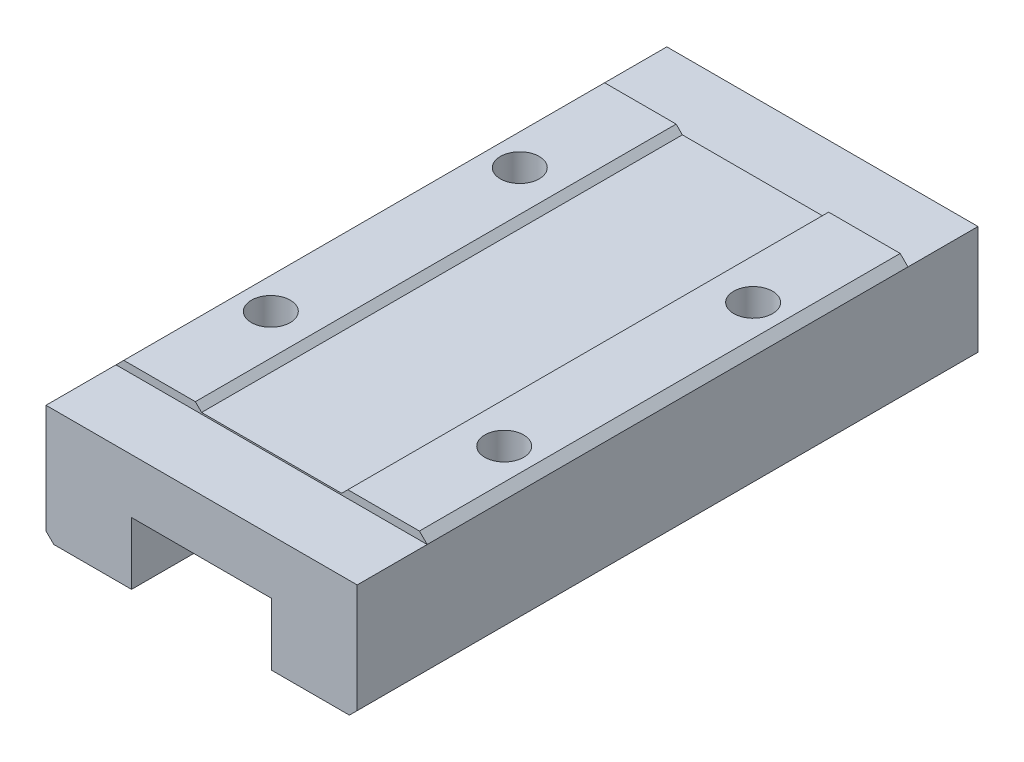
ISO-10303-21;
HEADER;
FILE_DESCRIPTION(('STEP AP214'),'2;1');
FILE_NAME('part.step','',(''),(''),'','','');
FILE_SCHEMA(('AUTOMOTIVE_DESIGN { 1 0 10303 214 1 1 1 1 }'));
ENDSEC;
DATA;
#1=APPLICATION_CONTEXT('core data for automotive mechanical design processes');
#2=APPLICATION_PROTOCOL_DEFINITION('international standard','automotive_design',2000,#1);
#3=PRODUCT_CONTEXT('',#1,'mechanical');
#4=PRODUCT('Part','Part','',(#3));
#5=PRODUCT_RELATED_PRODUCT_CATEGORY('part','',(#4));
#6=PRODUCT_DEFINITION_FORMATION('','',#4);
#7=PRODUCT_DEFINITION_CONTEXT('part definition',#1,'design');
#8=PRODUCT_DEFINITION('design','',#6,#7);
#9=PRODUCT_DEFINITION_SHAPE('','',#8);
#10=(LENGTH_UNIT() NAMED_UNIT(*) SI_UNIT(.MILLI.,.METRE.));
#11=(NAMED_UNIT(*) PLANE_ANGLE_UNIT() SI_UNIT($,.RADIAN.));
#12=(NAMED_UNIT(*) SI_UNIT($,.STERADIAN.) SOLID_ANGLE_UNIT());
#13=UNCERTAINTY_MEASURE_WITH_UNIT(LENGTH_MEASURE(1.E-05),#10,'distance_accuracy_value','');
#14=(GEOMETRIC_REPRESENTATION_CONTEXT(3) GLOBAL_UNCERTAINTY_ASSIGNED_CONTEXT((#13)) GLOBAL_UNIT_ASSIGNED_CONTEXT((#10,
#11,#12)) REPRESENTATION_CONTEXT('',''));
#15=CARTESIAN_POINT('',(0.,0.,0.));
#16=DIRECTION('',(0.,0.,1.));
#17=DIRECTION('',(1.,0.,0.));
#18=AXIS2_PLACEMENT_3D('',#15,#16,#17);
#19=CARTESIAN_POINT('',(-10.,10.,19.95));
#20=DIRECTION('',(0.,-1.,0.));
#21=DIRECTION('',(0.,0.,-1.));
#22=AXIS2_PLACEMENT_3D('',#19,#20,#21);
#23=PLANE('',#22);
#24=CARTESIAN_POINT('',(-7.5,10.,8.));
#25=DIRECTION('',(0.,1.,0.));
#26=DIRECTION('',(0.,0.,1.));
#27=AXIS2_PLACEMENT_3D('',#24,#25,#26);
#28=CIRCLE('',#27,1.25);
#29=CARTESIAN_POINT('',(-7.5,10.,9.25));
#30=VERTEX_POINT('',#29);
#31=EDGE_CURVE('E313',#30,#30,#28,.T.);
#32=ORIENTED_EDGE('',*,*,#31,.F.);
#33=EDGE_LOOP('',(#32));
#34=FACE_BOUND('',#33,.T.);
#35=CARTESIAN_POINT('',(-7.5,10.,-8.));
#36=DIRECTION('',(0.,1.,0.));
#37=DIRECTION('',(0.,0.,1.));
#38=AXIS2_PLACEMENT_3D('',#35,#36,#37);
#39=CIRCLE('',#38,1.25);
#40=CARTESIAN_POINT('',(-7.5,10.,-6.75));
#41=VERTEX_POINT('',#40);
#42=EDGE_CURVE('E337',#41,#41,#39,.T.);
#43=ORIENTED_EDGE('',*,*,#42,.F.);
#44=EDGE_LOOP('',(#43));
#45=FACE_BOUND('',#44,.T.);
#46=DIRECTION('',(-1.,0.,0.));
#47=VECTOR('',#46,1.);
#48=CARTESIAN_POINT('',(10.,10.,15.45));
#49=LINE('',#48,#47);
#50=CARTESIAN_POINT('',(-4.9,10.,15.45));
#51=VERTEX_POINT('',#50);
#52=CARTESIAN_POINT('',(-9.5,10.,15.45));
#53=VERTEX_POINT('',#52);
#54=EDGE_CURVE('E172',#51,#53,#49,.T.);
#55=ORIENTED_EDGE('',*,*,#54,.F.);
#56=DIRECTION('',(0.,0.,-1.));
#57=VECTOR('',#56,1.);
#58=CARTESIAN_POINT('',(-4.9,10.,19.95));
#59=LINE('',#58,#57);
#60=CARTESIAN_POINT('',(-4.9,10.,-15.45));
#61=VERTEX_POINT('',#60);
#62=EDGE_CURVE('E11',#51,#61,#59,.T.);
#63=ORIENTED_EDGE('',*,*,#62,.T.);
#64=DIRECTION('',(1.,0.,0.));
#65=VECTOR('',#64,1.);
#66=CARTESIAN_POINT('',(-10.,10.,-15.45));
#67=LINE('',#66,#65);
#68=CARTESIAN_POINT('',(-9.5,10.,-15.45));
#69=VERTEX_POINT('',#68);
#70=EDGE_CURVE('E345',#69,#61,#67,.T.);
#71=ORIENTED_EDGE('',*,*,#70,.F.);
#72=DIRECTION('',(0.,0.,1.));
#73=VECTOR('',#72,1.);
#74=CARTESIAN_POINT('',(-9.5,10.,19.95));
#75=LINE('',#74,#73);
#76=EDGE_CURVE('E203',#69,#53,#75,.T.);
#77=ORIENTED_EDGE('',*,*,#76,.T.);
#78=EDGE_LOOP('',(#55,#63,#71,#77));
#79=FACE_BOUND('',#78,.T.);
#80=ADVANCED_FACE('F16',(#34,#45,#79),#23,.F.);
#81=CARTESIAN_POINT('',(0.,0.,19.95));
#82=DIRECTION('',(0.,0.,-1.));
#83=DIRECTION('',(-1.,0.,0.));
#84=AXIS2_PLACEMENT_3D('',#81,#82,#83);
#85=PLANE('',#84);
#86=DIRECTION('',(1.,0.,0.));
#87=VECTOR('',#86,1.);
#88=CARTESIAN_POINT('',(10.,9.5,19.95));
#89=LINE('',#88,#87);
#90=CARTESIAN_POINT('',(-10.,9.5,19.95));
#91=VERTEX_POINT('',#90);
#92=CARTESIAN_POINT('',(10.,9.5,19.95));
#93=VERTEX_POINT('',#92);
#94=EDGE_CURVE('E362',#91,#93,#89,.T.);
#95=ORIENTED_EDGE('',*,*,#94,.F.);
#96=DIRECTION('',(0.,-1.,0.));
#97=VECTOR('',#96,1.);
#98=CARTESIAN_POINT('',(-10.,10.,19.95));
#99=LINE('',#98,#97);
#100=CARTESIAN_POINT('',(-10.,2.5,19.95));
#101=VERTEX_POINT('',#100);
#102=EDGE_CURVE('E292',#91,#101,#99,.T.);
#103=ORIENTED_EDGE('',*,*,#102,.T.);
#104=DIRECTION('',(-0.707106781186548,0.707106781186548,0.));
#105=VECTOR('',#104,1.);
#106=CARTESIAN_POINT('',(-9.5,2.,19.95));
#107=LINE('',#106,#105);
#108=CARTESIAN_POINT('',(-9.5,2.,19.95));
#109=VERTEX_POINT('',#108);
#110=EDGE_CURVE('E219',#101,#109,#107,.F.);
#111=ORIENTED_EDGE('',*,*,#110,.T.);
#112=DIRECTION('',(1.,0.,0.));
#113=VECTOR('',#112,1.);
#114=CARTESIAN_POINT('',(-10.,2.,19.95));
#115=LINE('',#114,#113);
#116=CARTESIAN_POINT('',(-4.5,2.,19.95));
#117=VERTEX_POINT('',#116);
#118=EDGE_CURVE('E289',#109,#117,#115,.T.);
#119=ORIENTED_EDGE('',*,*,#118,.T.);
#120=DIRECTION('',(0.,1.,0.));
#121=VECTOR('',#120,1.);
#122=CARTESIAN_POINT('',(-4.5,2.,19.95));
#123=LINE('',#122,#121);
#124=CARTESIAN_POINT('',(-4.5,6.,19.95));
#125=VERTEX_POINT('',#124);
#126=EDGE_CURVE('E259',#117,#125,#123,.T.);
#127=ORIENTED_EDGE('',*,*,#126,.T.);
#128=DIRECTION('',(1.,0.,0.));
#129=VECTOR('',#128,1.);
#130=CARTESIAN_POINT('',(-4.5,6.,19.95));
#131=LINE('',#130,#129);
#132=CARTESIAN_POINT('',(4.5,6.,19.95));
#133=VERTEX_POINT('',#132);
#134=EDGE_CURVE('E263',#125,#133,#131,.T.);
#135=ORIENTED_EDGE('',*,*,#134,.T.);
#136=DIRECTION('',(0.,-1.,0.));
#137=VECTOR('',#136,1.);
#138=CARTESIAN_POINT('',(4.5,6.,19.95));
#139=LINE('',#138,#137);
#140=CARTESIAN_POINT('',(4.5,2.,19.95));
#141=VERTEX_POINT('',#140);
#142=EDGE_CURVE('E304',#133,#141,#139,.T.);
#143=ORIENTED_EDGE('',*,*,#142,.T.);
#144=DIRECTION('',(1.,0.,0.));
#145=VECTOR('',#144,1.);
#146=CARTESIAN_POINT('',(4.5,2.,19.95));
#147=LINE('',#146,#145);
#148=CARTESIAN_POINT('',(9.5,2.,19.95));
#149=VERTEX_POINT('',#148);
#150=EDGE_CURVE('E300',#141,#149,#147,.T.);
#151=ORIENTED_EDGE('',*,*,#150,.T.);
#152=DIRECTION('',(-0.707106781186548,-0.707106781186548,0.));
#153=VECTOR('',#152,1.);
#154=CARTESIAN_POINT('',(10.,2.5,19.95));
#155=LINE('',#154,#153);
#156=CARTESIAN_POINT('',(10.,2.5,19.95));
#157=VERTEX_POINT('',#156);
#158=EDGE_CURVE('E222',#149,#157,#155,.F.);
#159=ORIENTED_EDGE('',*,*,#158,.T.);
#160=DIRECTION('',(0.,1.,0.));
#161=VECTOR('',#160,1.);
#162=CARTESIAN_POINT('',(10.,10.,19.95));
#163=LINE('',#162,#161);
#164=EDGE_CURVE('E296',#157,#93,#163,.T.);
#165=ORIENTED_EDGE('',*,*,#164,.T.);
#166=EDGE_LOOP('',(#95,#103,#111,#119,#127,#135,#143,#151,#159,#165));
#167=FACE_BOUND('',#166,.T.);
#168=ADVANCED_FACE('F402',(#167),#85,.F.);
#169=CARTESIAN_POINT('',(0.,0.,-19.95));
#170=DIRECTION('',(0.,0.,-1.));
#171=DIRECTION('',(-1.,0.,0.));
#172=AXIS2_PLACEMENT_3D('',#169,#170,#171);
#173=PLANE('',#172);
#174=DIRECTION('',(0.,-1.,0.));
#175=VECTOR('',#174,1.);
#176=CARTESIAN_POINT('',(-10.,10.,-19.95));
#177=LINE('',#176,#175);
#178=CARTESIAN_POINT('',(-10.,9.5,-19.95));
#179=VERTEX_POINT('',#178);
#180=CARTESIAN_POINT('',(-10.,2.5,-19.95));
#181=VERTEX_POINT('',#180);
#182=EDGE_CURVE('E267',#179,#181,#177,.T.);
#183=ORIENTED_EDGE('',*,*,#182,.F.);
#184=DIRECTION('',(-1.,0.,0.));
#185=VECTOR('',#184,1.);
#186=CARTESIAN_POINT('',(-10.,9.5,-19.95));
#187=LINE('',#186,#185);
#188=CARTESIAN_POINT('',(10.,9.5,-19.95));
#189=VERTEX_POINT('',#188);
#190=EDGE_CURVE('E344',#189,#179,#187,.T.);
#191=ORIENTED_EDGE('',*,*,#190,.F.);
#192=DIRECTION('',(0.,1.,0.));
#193=VECTOR('',#192,1.);
#194=CARTESIAN_POINT('',(10.,10.,-19.95));
#195=LINE('',#194,#193);
#196=CARTESIAN_POINT('',(10.,2.5,-19.95));
#197=VERTEX_POINT('',#196);
#198=EDGE_CURVE('E271',#197,#189,#195,.T.);
#199=ORIENTED_EDGE('',*,*,#198,.F.);
#200=DIRECTION('',(0.707106781186548,0.707106781186548,0.));
#201=VECTOR('',#200,1.);
#202=CARTESIAN_POINT('',(3.75,-3.75,-19.95));
#203=LINE('',#202,#201);
#204=CARTESIAN_POINT('',(9.5,2.,-19.95));
#205=VERTEX_POINT('',#204);
#206=EDGE_CURVE('E236',#197,#205,#203,.F.);
#207=ORIENTED_EDGE('',*,*,#206,.T.);
#208=DIRECTION('',(1.,0.,0.));
#209=VECTOR('',#208,1.);
#210=CARTESIAN_POINT('',(4.5,2.,-19.95));
#211=LINE('',#210,#209);
#212=CARTESIAN_POINT('',(4.5,2.,-19.95));
#213=VERTEX_POINT('',#212);
#214=EDGE_CURVE('E275',#213,#205,#211,.T.);
#215=ORIENTED_EDGE('',*,*,#214,.F.);
#216=DIRECTION('',(0.,-1.,0.));
#217=VECTOR('',#216,1.);
#218=CARTESIAN_POINT('',(4.5,6.,-19.95));
#219=LINE('',#218,#217);
#220=CARTESIAN_POINT('',(4.5,6.,-19.95));
#221=VERTEX_POINT('',#220);
#222=EDGE_CURVE('E279',#221,#213,#219,.T.);
#223=ORIENTED_EDGE('',*,*,#222,.F.);
#224=DIRECTION('',(1.,0.,0.));
#225=VECTOR('',#224,1.);
#226=CARTESIAN_POINT('',(-4.5,6.,-19.95));
#227=LINE('',#226,#225);
#228=CARTESIAN_POINT('',(-4.5,6.,-19.95));
#229=VERTEX_POINT('',#228);
#230=EDGE_CURVE('E282',#229,#221,#227,.T.);
#231=ORIENTED_EDGE('',*,*,#230,.F.);
#232=DIRECTION('',(0.,1.,0.));
#233=VECTOR('',#232,1.);
#234=CARTESIAN_POINT('',(-4.5,2.,-19.95));
#235=LINE('',#234,#233);
#236=CARTESIAN_POINT('',(-4.5,2.,-19.95));
#237=VERTEX_POINT('',#236);
#238=EDGE_CURVE('E260',#237,#229,#235,.T.);
#239=ORIENTED_EDGE('',*,*,#238,.F.);
#240=DIRECTION('',(1.,0.,0.));
#241=VECTOR('',#240,1.);
#242=CARTESIAN_POINT('',(-10.,2.,-19.95));
#243=LINE('',#242,#241);
#244=CARTESIAN_POINT('',(-9.5,2.,-19.95));
#245=VERTEX_POINT('',#244);
#246=EDGE_CURVE('E264',#245,#237,#243,.T.);
#247=ORIENTED_EDGE('',*,*,#246,.F.);
#248=DIRECTION('',(0.707106781186548,-0.707106781186548,0.));
#249=VECTOR('',#248,1.);
#250=CARTESIAN_POINT('',(-3.75,-3.75,-19.95));
#251=LINE('',#250,#249);
#252=EDGE_CURVE('E233',#245,#181,#251,.F.);
#253=ORIENTED_EDGE('',*,*,#252,.T.);
#254=EDGE_LOOP('',(#183,#191,#199,#207,#215,#223,#231,#239,#247,#253));
#255=FACE_BOUND('',#254,.T.);
#256=ADVANCED_FACE('F409',(#255),#173,.T.);
#257=CARTESIAN_POINT('',(-4.5,6.,19.95));
#258=DIRECTION('',(0.,1.,0.));
#259=DIRECTION('',(-1.,0.,0.));
#260=AXIS2_PLACEMENT_3D('',#257,#258,#259);
#261=PLANE('',#260);
#262=ORIENTED_EDGE('',*,*,#230,.T.);
#263=DIRECTION('',(0.,0.,-1.));
#264=VECTOR('',#263,1.);
#265=CARTESIAN_POINT('',(4.5,6.,19.95));
#266=LINE('',#265,#264);
#267=EDGE_CURVE('E243',#133,#221,#266,.T.);
#268=ORIENTED_EDGE('',*,*,#267,.F.);
#269=ORIENTED_EDGE('',*,*,#134,.F.);
#270=DIRECTION('',(0.,0.,-1.));
#271=VECTOR('',#270,1.);
#272=CARTESIAN_POINT('',(-4.5,6.,19.95));
#273=LINE('',#272,#271);
#274=EDGE_CURVE('E255',#125,#229,#273,.T.);
#275=ORIENTED_EDGE('',*,*,#274,.T.);
#276=EDGE_LOOP('',(#262,#268,#269,#275));
#277=FACE_BOUND('',#276,.T.);
#278=ADVANCED_FACE('F463',(#277),#261,.F.);
#279=CARTESIAN_POINT('',(4.5,6.,19.95));
#280=DIRECTION('',(1.,0.,0.));
#281=DIRECTION('',(0.,0.,-1.));
#282=AXIS2_PLACEMENT_3D('',#279,#280,#281);
#283=PLANE('',#282);
#284=ORIENTED_EDGE('',*,*,#222,.T.);
#285=DIRECTION('',(0.,0.,-1.));
#286=VECTOR('',#285,1.);
#287=CARTESIAN_POINT('',(4.5,2.,19.95));
#288=LINE('',#287,#286);
#289=EDGE_CURVE('E247',#141,#213,#288,.T.);
#290=ORIENTED_EDGE('',*,*,#289,.F.);
#291=ORIENTED_EDGE('',*,*,#142,.F.);
#292=ORIENTED_EDGE('',*,*,#267,.T.);
#293=EDGE_LOOP('',(#284,#290,#291,#292));
#294=FACE_BOUND('',#293,.T.);
#295=ADVANCED_FACE('F504',(#294),#283,.F.);
#296=CARTESIAN_POINT('',(4.5,2.,19.95));
#297=DIRECTION('',(0.,1.,0.));
#298=DIRECTION('',(0.,0.,1.));
#299=AXIS2_PLACEMENT_3D('',#296,#297,#298);
#300=PLANE('',#299);
#301=ORIENTED_EDGE('',*,*,#214,.T.);
#302=DIRECTION('',(0.,0.,1.));
#303=VECTOR('',#302,1.);
#304=CARTESIAN_POINT('',(9.5,2.,19.95));
#305=LINE('',#304,#303);
#306=EDGE_CURVE('E207',#205,#149,#305,.T.);
#307=ORIENTED_EDGE('',*,*,#306,.T.);
#308=ORIENTED_EDGE('',*,*,#150,.F.);
#309=ORIENTED_EDGE('',*,*,#289,.T.);
#310=EDGE_LOOP('',(#301,#307,#308,#309));
#311=FACE_BOUND('',#310,.T.);
#312=ADVANCED_FACE('F427',(#311),#300,.F.);
#313=CARTESIAN_POINT('',(10.,10.,19.95));
#314=DIRECTION('',(-1.,0.,0.));
#315=DIRECTION('',(0.,-1.,0.));
#316=AXIS2_PLACEMENT_3D('',#313,#314,#315);
#317=PLANE('',#316);
#318=ORIENTED_EDGE('',*,*,#164,.F.);
#319=DIRECTION('',(0.,0.,-1.));
#320=VECTOR('',#319,1.);
#321=CARTESIAN_POINT('',(10.,2.5,19.95));
#322=LINE('',#321,#320);
#323=EDGE_CURVE('E210',#157,#197,#322,.T.);
#324=ORIENTED_EDGE('',*,*,#323,.T.);
#325=ORIENTED_EDGE('',*,*,#198,.T.);
#326=DIRECTION('',(0.,0.,1.));
#327=VECTOR('',#326,1.);
#328=CARTESIAN_POINT('',(10.,9.5,19.95));
#329=LINE('',#328,#327);
#330=CARTESIAN_POINT('',(10.,9.5,-15.45));
#331=VERTEX_POINT('',#330);
#332=EDGE_CURVE('E214',#189,#331,#329,.T.);
#333=ORIENTED_EDGE('',*,*,#332,.T.);
#334=CARTESIAN_POINT('',(10.,9.5,15.45));
#335=VERTEX_POINT('',#334);
#336=EDGE_CURVE('E218',#331,#335,#329,.T.);
#337=ORIENTED_EDGE('',*,*,#336,.T.);
#338=DIRECTION('',(0.,0.,-1.));
#339=VECTOR('',#338,1.);
#340=CARTESIAN_POINT('',(10.,9.5,19.95));
#341=LINE('',#340,#339);
#342=EDGE_CURVE('E367',#93,#335,#341,.T.);
#343=ORIENTED_EDGE('',*,*,#342,.F.);
#344=EDGE_LOOP('',(#318,#324,#325,#333,#337,#343));
#345=FACE_BOUND('',#344,.T.);
#346=ADVANCED_FACE('F418',(#345),#317,.F.);
#347=CARTESIAN_POINT('',(7.5,10.,8.));
#348=DIRECTION('',(0.,1.,0.));
#349=DIRECTION('',(0.,0.,1.));
#350=AXIS2_PLACEMENT_3D('',#347,#348,#349);
#351=CIRCLE('',#350,1.25);
#352=CARTESIAN_POINT('',(7.5,10.,9.25));
#353=VERTEX_POINT('',#352);
#354=EDGE_CURVE('E329',#353,#353,#351,.T.);
#355=ORIENTED_EDGE('',*,*,#354,.F.);
#356=EDGE_LOOP('',(#355));
#357=FACE_BOUND('',#356,.T.);
#358=CARTESIAN_POINT('',(7.5,10.,-8.));
#359=DIRECTION('',(0.,1.,0.));
#360=DIRECTION('',(0.,0.,1.));
#361=AXIS2_PLACEMENT_3D('',#358,#359,#360);
#362=CIRCLE('',#361,1.25);
#363=CARTESIAN_POINT('',(7.5,10.,-6.75));
#364=VERTEX_POINT('',#363);
#365=EDGE_CURVE('E321',#364,#364,#362,.T.);
#366=ORIENTED_EDGE('',*,*,#365,.F.);
#367=EDGE_LOOP('',(#366));
#368=FACE_BOUND('',#367,.T.);
#369=CARTESIAN_POINT('',(4.9,10.,-15.45));
#370=VERTEX_POINT('',#369);
#371=CARTESIAN_POINT('',(9.5,10.,-15.45));
#372=VERTEX_POINT('',#371);
#373=EDGE_CURVE('E349',#370,#372,#67,.T.);
#374=ORIENTED_EDGE('',*,*,#373,.F.);
#375=DIRECTION('',(0.,0.,1.));
#376=VECTOR('',#375,1.);
#377=CARTESIAN_POINT('',(4.9,10.,19.95));
#378=LINE('',#377,#376);
#379=CARTESIAN_POINT('',(4.9,10.,15.45));
#380=VERTEX_POINT('',#379);
#381=EDGE_CURVE('E177',#370,#380,#378,.T.);
#382=ORIENTED_EDGE('',*,*,#381,.T.);
#383=CARTESIAN_POINT('',(9.5,10.,15.45));
#384=VERTEX_POINT('',#383);
#385=EDGE_CURVE('E363',#384,#380,#49,.T.);
#386=ORIENTED_EDGE('',*,*,#385,.F.);
#387=DIRECTION('',(0.,0.,-1.));
#388=VECTOR('',#387,1.);
#389=CARTESIAN_POINT('',(9.5,10.,19.95));
#390=LINE('',#389,#388);
#391=EDGE_CURVE('E199',#384,#372,#390,.T.);
#392=ORIENTED_EDGE('',*,*,#391,.T.);
#393=EDGE_LOOP('',(#374,#382,#386,#392));
#394=FACE_BOUND('',#393,.T.);
#395=ADVANCED_FACE('F381',(#357,#368,#394),#23,.F.);
#396=CARTESIAN_POINT('',(-10.,10.,19.95));
#397=DIRECTION('',(1.,0.,0.));
#398=DIRECTION('',(0.,1.,0.));
#399=AXIS2_PLACEMENT_3D('',#396,#397,#398);
#400=PLANE('',#399);
#401=ORIENTED_EDGE('',*,*,#182,.T.);
#402=DIRECTION('',(0.,0.,1.));
#403=VECTOR('',#402,1.);
#404=CARTESIAN_POINT('',(-10.,2.5,19.95));
#405=LINE('',#404,#403);
#406=EDGE_CURVE('E225',#181,#101,#405,.T.);
#407=ORIENTED_EDGE('',*,*,#406,.T.);
#408=ORIENTED_EDGE('',*,*,#102,.F.);
#409=DIRECTION('',(0.,0.,-1.));
#410=VECTOR('',#409,1.);
#411=CARTESIAN_POINT('',(-10.,9.5,19.95));
#412=LINE('',#411,#410);
#413=CARTESIAN_POINT('',(-10.,9.5,15.45));
#414=VERTEX_POINT('',#413);
#415=EDGE_CURVE('E228',#91,#414,#412,.T.);
#416=ORIENTED_EDGE('',*,*,#415,.T.);
#417=CARTESIAN_POINT('',(-10.,9.5,-15.45));
#418=VERTEX_POINT('',#417);
#419=EDGE_CURVE('E232',#414,#418,#412,.T.);
#420=ORIENTED_EDGE('',*,*,#419,.T.);
#421=DIRECTION('',(0.,0.,1.));
#422=VECTOR('',#421,1.);
#423=CARTESIAN_POINT('',(-10.,9.5,-19.95));
#424=LINE('',#423,#422);
#425=EDGE_CURVE('E348',#179,#418,#424,.T.);
#426=ORIENTED_EDGE('',*,*,#425,.F.);
#427=EDGE_LOOP('',(#401,#407,#408,#416,#420,#426));
#428=FACE_BOUND('',#427,.T.);
#429=ADVANCED_FACE('F417',(#428),#400,.F.);
#430=CARTESIAN_POINT('',(-10.,2.,19.95));
#431=DIRECTION('',(0.,1.,0.));
#432=DIRECTION('',(0.,0.,1.));
#433=AXIS2_PLACEMENT_3D('',#430,#431,#432);
#434=PLANE('',#433);
#435=ORIENTED_EDGE('',*,*,#118,.F.);
#436=DIRECTION('',(0.,0.,-1.));
#437=VECTOR('',#436,1.);
#438=CARTESIAN_POINT('',(-9.5,2.,19.95));
#439=LINE('',#438,#437);
#440=EDGE_CURVE('E239',#109,#245,#439,.T.);
#441=ORIENTED_EDGE('',*,*,#440,.T.);
#442=ORIENTED_EDGE('',*,*,#246,.T.);
#443=DIRECTION('',(0.,0.,-1.));
#444=VECTOR('',#443,1.);
#445=CARTESIAN_POINT('',(-4.5,2.,19.95));
#446=LINE('',#445,#444);
#447=EDGE_CURVE('E251',#117,#237,#446,.T.);
#448=ORIENTED_EDGE('',*,*,#447,.F.);
#449=EDGE_LOOP('',(#435,#441,#442,#448));
#450=FACE_BOUND('',#449,.T.);
#451=ADVANCED_FACE('F425',(#450),#434,.F.);
#452=CARTESIAN_POINT('',(-4.5,2.,19.95));
#453=DIRECTION('',(-1.,0.,0.));
#454=DIRECTION('',(0.,0.,1.));
#455=AXIS2_PLACEMENT_3D('',#452,#453,#454);
#456=PLANE('',#455);
#457=ORIENTED_EDGE('',*,*,#238,.T.);
#458=ORIENTED_EDGE('',*,*,#274,.F.);
#459=ORIENTED_EDGE('',*,*,#126,.F.);
#460=ORIENTED_EDGE('',*,*,#447,.T.);
#461=EDGE_LOOP('',(#457,#458,#459,#460));
#462=FACE_BOUND('',#461,.T.);
#463=ADVANCED_FACE('F458',(#462),#456,.F.);
#464=CARTESIAN_POINT('',(-7.5,5.6,8.));
#465=DIRECTION('',(0.,1.,0.));
#466=DIRECTION('',(0.,0.,1.));
#467=AXIS2_PLACEMENT_3D('',#464,#465,#466);
#468=CONICAL_SURFACE('',#467,1.25,1.02974425867665);
#469=CARTESIAN_POINT('',(-7.5,4.84892422621555,8.));
#470=VERTEX_POINT('',#469);
#471=VERTEX_LOOP('',#470);
#472=FACE_BOUND('',#471,.T.);
#473=CARTESIAN_POINT('',(-7.5,5.6,8.));
#474=DIRECTION('',(0.,1.,0.));
#475=DIRECTION('',(0.,0.,1.));
#476=AXIS2_PLACEMENT_3D('',#473,#474,#475);
#477=CIRCLE('',#476,1.25);
#478=CARTESIAN_POINT('',(-7.5,5.6,9.25));
#479=VERTEX_POINT('',#478);
#480=EDGE_CURVE('E286',#479,#479,#477,.T.);
#481=ORIENTED_EDGE('',*,*,#480,.T.);
#482=EDGE_LOOP('',(#481));
#483=FACE_BOUND('',#482,.T.);
#484=ADVANCED_FACE('F455',(#472,#483),#468,.F.);
#485=CARTESIAN_POINT('',(-7.5,10.,8.));
#486=DIRECTION('',(0.,1.,0.));
#487=DIRECTION('',(0.,0.,1.));
#488=AXIS2_PLACEMENT_3D('',#485,#486,#487);
#489=CYLINDRICAL_SURFACE('',#488,1.25);
#490=ORIENTED_EDGE('',*,*,#480,.F.);
#491=EDGE_LOOP('',(#490));
#492=FACE_BOUND('',#491,.T.);
#493=ORIENTED_EDGE('',*,*,#31,.T.);
#494=EDGE_LOOP('',(#493));
#495=FACE_BOUND('',#494,.T.);
#496=ADVANCED_FACE('F447',(#492,#495),#489,.F.);
#497=CARTESIAN_POINT('',(7.5,5.6,-8.));
#498=DIRECTION('',(0.,1.,0.));
#499=DIRECTION('',(0.,0.,1.));
#500=AXIS2_PLACEMENT_3D('',#497,#498,#499);
#501=CONICAL_SURFACE('',#500,1.25,1.02974425867665);
#502=CARTESIAN_POINT('',(7.5,4.84892422621555,-8.));
#503=VERTEX_POINT('',#502);
#504=VERTEX_LOOP('',#503);
#505=FACE_BOUND('',#504,.T.);
#506=CARTESIAN_POINT('',(7.5,5.6,-8.));
#507=DIRECTION('',(0.,1.,0.));
#508=DIRECTION('',(0.,0.,1.));
#509=AXIS2_PLACEMENT_3D('',#506,#507,#508);
#510=CIRCLE('',#509,1.25);
#511=CARTESIAN_POINT('',(7.5,5.6,-6.75));
#512=VERTEX_POINT('',#511);
#513=EDGE_CURVE('E317',#512,#512,#510,.T.);
#514=ORIENTED_EDGE('',*,*,#513,.T.);
#515=EDGE_LOOP('',(#514));
#516=FACE_BOUND('',#515,.T.);
#517=ADVANCED_FACE('F436',(#505,#516),#501,.F.);
#518=CARTESIAN_POINT('',(7.5,10.,-8.));
#519=DIRECTION('',(0.,1.,0.));
#520=DIRECTION('',(0.,0.,1.));
#521=AXIS2_PLACEMENT_3D('',#518,#519,#520);
#522=CYLINDRICAL_SURFACE('',#521,1.25);
#523=ORIENTED_EDGE('',*,*,#513,.F.);
#524=EDGE_LOOP('',(#523));
#525=FACE_BOUND('',#524,.T.);
#526=ORIENTED_EDGE('',*,*,#365,.T.);
#527=EDGE_LOOP('',(#526));
#528=FACE_BOUND('',#527,.T.);
#529=ADVANCED_FACE('F433',(#525,#528),#522,.F.);
#530=CARTESIAN_POINT('',(7.5,5.6,8.));
#531=DIRECTION('',(0.,1.,0.));
#532=DIRECTION('',(0.,0.,1.));
#533=AXIS2_PLACEMENT_3D('',#530,#531,#532);
#534=CONICAL_SURFACE('',#533,1.25,1.02974425867665);
#535=CARTESIAN_POINT('',(7.5,4.84892422621555,8.));
#536=VERTEX_POINT('',#535);
#537=VERTEX_LOOP('',#536);
#538=FACE_BOUND('',#537,.T.);
#539=CARTESIAN_POINT('',(7.5,5.6,8.));
#540=DIRECTION('',(0.,1.,0.));
#541=DIRECTION('',(0.,0.,1.));
#542=AXIS2_PLACEMENT_3D('',#539,#540,#541);
#543=CIRCLE('',#542,1.25);
#544=CARTESIAN_POINT('',(7.5,5.6,9.25));
#545=VERTEX_POINT('',#544);
#546=EDGE_CURVE('E325',#545,#545,#543,.T.);
#547=ORIENTED_EDGE('',*,*,#546,.T.);
#548=EDGE_LOOP('',(#547));
#549=FACE_BOUND('',#548,.T.);
#550=ADVANCED_FACE('F435',(#538,#549),#534,.F.);
#551=CARTESIAN_POINT('',(7.5,10.,8.));
#552=DIRECTION('',(0.,1.,0.));
#553=DIRECTION('',(0.,0.,1.));
#554=AXIS2_PLACEMENT_3D('',#551,#552,#553);
#555=CYLINDRICAL_SURFACE('',#554,1.25);
#556=ORIENTED_EDGE('',*,*,#546,.F.);
#557=EDGE_LOOP('',(#556));
#558=FACE_BOUND('',#557,.T.);
#559=ORIENTED_EDGE('',*,*,#354,.T.);
#560=EDGE_LOOP('',(#559));
#561=FACE_BOUND('',#560,.T.);
#562=ADVANCED_FACE('F444',(#558,#561),#555,.F.);
#563=CARTESIAN_POINT('',(-7.5,5.6,-8.));
#564=DIRECTION('',(0.,1.,0.));
#565=DIRECTION('',(0.,0.,1.));
#566=AXIS2_PLACEMENT_3D('',#563,#564,#565);
#567=CONICAL_SURFACE('',#566,1.25,1.02974425867665);
#568=CARTESIAN_POINT('',(-7.5,4.84892422621555,-8.));
#569=VERTEX_POINT('',#568);
#570=VERTEX_LOOP('',#569);
#571=FACE_BOUND('',#570,.T.);
#572=CARTESIAN_POINT('',(-7.5,5.6,-8.));
#573=DIRECTION('',(0.,1.,0.));
#574=DIRECTION('',(0.,0.,1.));
#575=AXIS2_PLACEMENT_3D('',#572,#573,#574);
#576=CIRCLE('',#575,1.25);
#577=CARTESIAN_POINT('',(-7.5,5.6,-6.75));
#578=VERTEX_POINT('',#577);
#579=EDGE_CURVE('E333',#578,#578,#576,.T.);
#580=ORIENTED_EDGE('',*,*,#579,.T.);
#581=EDGE_LOOP('',(#580));
#582=FACE_BOUND('',#581,.T.);
#583=ADVANCED_FACE('F608',(#571,#582),#567,.F.);
#584=CARTESIAN_POINT('',(-7.5,10.,-8.));
#585=DIRECTION('',(0.,1.,0.));
#586=DIRECTION('',(0.,0.,1.));
#587=AXIS2_PLACEMENT_3D('',#584,#585,#586);
#588=CYLINDRICAL_SURFACE('',#587,1.25);
#589=ORIENTED_EDGE('',*,*,#579,.F.);
#590=EDGE_LOOP('',(#589));
#591=FACE_BOUND('',#590,.T.);
#592=ORIENTED_EDGE('',*,*,#42,.T.);
#593=EDGE_LOOP('',(#592));
#594=FACE_BOUND('',#593,.T.);
#595=ADVANCED_FACE('F530',(#591,#594),#588,.F.);
#596=CARTESIAN_POINT('',(-9.5,2.,19.95));
#597=DIRECTION('',(0.707106781186548,0.707106781186548,0.));
#598=DIRECTION('',(0.,0.,-1.));
#599=AXIS2_PLACEMENT_3D('',#596,#597,#598);
#600=PLANE('',#599);
#601=ORIENTED_EDGE('',*,*,#110,.F.);
#602=ORIENTED_EDGE('',*,*,#406,.F.);
#603=ORIENTED_EDGE('',*,*,#252,.F.);
#604=ORIENTED_EDGE('',*,*,#440,.F.);
#605=EDGE_LOOP('',(#601,#602,#603,#604));
#606=FACE_BOUND('',#605,.T.);
#607=ADVANCED_FACE('F480',(#606),#600,.F.);
#608=CARTESIAN_POINT('',(10.,2.5,19.95));
#609=DIRECTION('',(-0.707106781186548,0.707106781186548,0.));
#610=DIRECTION('',(0.,0.,-1.));
#611=AXIS2_PLACEMENT_3D('',#608,#609,#610);
#612=PLANE('',#611);
#613=ORIENTED_EDGE('',*,*,#158,.F.);
#614=ORIENTED_EDGE('',*,*,#306,.F.);
#615=ORIENTED_EDGE('',*,*,#206,.F.);
#616=ORIENTED_EDGE('',*,*,#323,.F.);
#617=EDGE_LOOP('',(#613,#614,#615,#616));
#618=FACE_BOUND('',#617,.T.);
#619=ADVANCED_FACE('F497',(#618),#612,.F.);
#620=CARTESIAN_POINT('',(9.5,10.,19.95));
#621=DIRECTION('',(-0.707106781186548,-0.707106781186548,0.));
#622=DIRECTION('',(0.,0.,-1.));
#623=AXIS2_PLACEMENT_3D('',#620,#621,#622);
#624=PLANE('',#623);
#625=DIRECTION('',(0.707106781186548,-0.707106781186548,0.));
#626=VECTOR('',#625,1.);
#627=CARTESIAN_POINT('',(9.5,10.,15.45));
#628=LINE('',#627,#626);
#629=EDGE_CURVE('E359',#335,#384,#628,.F.);
#630=ORIENTED_EDGE('',*,*,#629,.F.);
#631=ORIENTED_EDGE('',*,*,#336,.F.);
#632=DIRECTION('',(-0.707106781186548,0.707106781186548,0.));
#633=VECTOR('',#632,1.);
#634=CARTESIAN_POINT('',(9.5,10.,-15.45));
#635=LINE('',#634,#633);
#636=EDGE_CURVE('E341',#372,#331,#635,.F.);
#637=ORIENTED_EDGE('',*,*,#636,.F.);
#638=ORIENTED_EDGE('',*,*,#391,.F.);
#639=EDGE_LOOP('',(#630,#631,#637,#638));
#640=FACE_BOUND('',#639,.T.);
#641=ADVANCED_FACE('F515',(#640),#624,.F.);
#642=CARTESIAN_POINT('',(-10.,9.5,19.95));
#643=DIRECTION('',(0.707106781186548,-0.707106781186548,0.));
#644=DIRECTION('',(0.,0.,-1.));
#645=AXIS2_PLACEMENT_3D('',#642,#643,#644);
#646=PLANE('',#645);
#647=DIRECTION('',(0.707106781186548,0.707106781186548,0.));
#648=VECTOR('',#647,1.);
#649=CARTESIAN_POINT('',(-10.,9.5,15.45));
#650=LINE('',#649,#648);
#651=EDGE_CURVE('E192',#53,#414,#650,.F.);
#652=ORIENTED_EDGE('',*,*,#651,.F.);
#653=ORIENTED_EDGE('',*,*,#76,.F.);
#654=DIRECTION('',(-0.707106781186548,-0.707106781186548,0.));
#655=VECTOR('',#654,1.);
#656=CARTESIAN_POINT('',(-10.,9.5,-15.45));
#657=LINE('',#656,#655);
#658=EDGE_CURVE('E196',#418,#69,#657,.F.);
#659=ORIENTED_EDGE('',*,*,#658,.F.);
#660=ORIENTED_EDGE('',*,*,#419,.F.);
#661=EDGE_LOOP('',(#652,#653,#659,#660));
#662=FACE_BOUND('',#661,.T.);
#663=ADVANCED_FACE('F392',(#662),#646,.F.);
#664=CARTESIAN_POINT('',(-10.,9.5,-15.45));
#665=DIRECTION('',(0.,0.,1.));
#666=DIRECTION('',(1.,0.,0.));
#667=AXIS2_PLACEMENT_3D('',#664,#665,#666);
#668=PLANE('',#667);
#669=DIRECTION('',(1.,0.,0.));
#670=VECTOR('',#669,1.);
#671=CARTESIAN_POINT('',(-10.,9.6,-15.45));
#672=LINE('',#671,#670);
#673=CARTESIAN_POINT('',(-4.5,9.6,-15.45));
#674=VERTEX_POINT('',#673);
#675=CARTESIAN_POINT('',(4.5,9.6,-15.45));
#676=VERTEX_POINT('',#675);
#677=EDGE_CURVE('E158',#674,#676,#672,.T.);
#678=ORIENTED_EDGE('',*,*,#677,.T.);
#679=DIRECTION('',(-0.707106781186547,-0.707106781186548,0.));
#680=VECTOR('',#679,1.);
#681=CARTESIAN_POINT('',(4.9,10.,-15.45));
#682=LINE('',#681,#680);
#683=EDGE_CURVE('E25',#676,#370,#682,.F.);
#684=ORIENTED_EDGE('',*,*,#683,.T.);
#685=ORIENTED_EDGE('',*,*,#373,.T.);
#686=ORIENTED_EDGE('',*,*,#636,.T.);
#687=DIRECTION('',(1.,0.,0.));
#688=VECTOR('',#687,1.);
#689=CARTESIAN_POINT('',(-10.,9.5,-15.45));
#690=LINE('',#689,#688);
#691=EDGE_CURVE('E352',#418,#331,#690,.T.);
#692=ORIENTED_EDGE('',*,*,#691,.F.);
#693=ORIENTED_EDGE('',*,*,#658,.T.);
#694=ORIENTED_EDGE('',*,*,#70,.T.);
#695=DIRECTION('',(-0.707106781186548,0.707106781186548,0.));
#696=VECTOR('',#695,1.);
#697=CARTESIAN_POINT('',(-4.5,9.6,-15.45));
#698=LINE('',#697,#696);
#699=EDGE_CURVE('E170',#61,#674,#698,.F.);
#700=ORIENTED_EDGE('',*,*,#699,.T.);
#701=EDGE_LOOP('',(#678,#684,#685,#686,#692,#693,#694,#700));
#702=FACE_BOUND('',#701,.T.);
#703=ADVANCED_FACE('F167',(#702),#668,.F.);
#704=CARTESIAN_POINT('',(0.,9.5,0.));
#705=DIRECTION('',(0.,1.,0.));
#706=DIRECTION('',(0.,0.,1.));
#707=AXIS2_PLACEMENT_3D('',#704,#705,#706);
#708=PLANE('',#707);
#709=ORIENTED_EDGE('',*,*,#425,.T.);
#710=ORIENTED_EDGE('',*,*,#691,.T.);
#711=ORIENTED_EDGE('',*,*,#332,.F.);
#712=ORIENTED_EDGE('',*,*,#190,.T.);
#713=EDGE_LOOP('',(#709,#710,#711,#712));
#714=FACE_BOUND('',#713,.T.);
#715=ADVANCED_FACE('F488',(#714),#708,.T.);
#716=CARTESIAN_POINT('',(10.,9.5,15.45));
#717=DIRECTION('',(0.,0.,-1.));
#718=DIRECTION('',(-1.,0.,0.));
#719=AXIS2_PLACEMENT_3D('',#716,#717,#718);
#720=PLANE('',#719);
#721=ORIENTED_EDGE('',*,*,#385,.T.);
#722=DIRECTION('',(0.707106781186547,0.707106781186548,0.));
#723=VECTOR('',#722,1.);
#724=CARTESIAN_POINT('',(4.9,10.,15.45));
#725=LINE('',#724,#723);
#726=CARTESIAN_POINT('',(4.5,9.6,15.45));
#727=VERTEX_POINT('',#726);
#728=EDGE_CURVE('E181',#380,#727,#725,.F.);
#729=ORIENTED_EDGE('',*,*,#728,.T.);
#730=DIRECTION('',(-1.,0.,0.));
#731=VECTOR('',#730,1.);
#732=CARTESIAN_POINT('',(10.,9.6,15.45));
#733=LINE('',#732,#731);
#734=CARTESIAN_POINT('',(-4.5,9.6,15.45));
#735=VERTEX_POINT('',#734);
#736=EDGE_CURVE('E160',#727,#735,#733,.T.);
#737=ORIENTED_EDGE('',*,*,#736,.T.);
#738=DIRECTION('',(0.707106781186548,-0.707106781186548,0.));
#739=VECTOR('',#738,1.);
#740=CARTESIAN_POINT('',(-4.5,9.6,15.45));
#741=LINE('',#740,#739);
#742=EDGE_CURVE('E38',#735,#51,#741,.F.);
#743=ORIENTED_EDGE('',*,*,#742,.T.);
#744=ORIENTED_EDGE('',*,*,#54,.T.);
#745=ORIENTED_EDGE('',*,*,#651,.T.);
#746=DIRECTION('',(-1.,0.,0.));
#747=VECTOR('',#746,1.);
#748=CARTESIAN_POINT('',(10.,9.5,15.45));
#749=LINE('',#748,#747);
#750=EDGE_CURVE('E370',#335,#414,#749,.T.);
#751=ORIENTED_EDGE('',*,*,#750,.F.);
#752=ORIENTED_EDGE('',*,*,#629,.T.);
#753=EDGE_LOOP('',(#721,#729,#737,#743,#744,#745,#751,#752));
#754=FACE_BOUND('',#753,.T.);
#755=ADVANCED_FACE('F378',(#754),#720,.F.);
#756=CARTESIAN_POINT('',(0.,9.5,0.));
#757=DIRECTION('',(0.,1.,0.));
#758=DIRECTION('',(0.,0.,1.));
#759=AXIS2_PLACEMENT_3D('',#756,#757,#758);
#760=PLANE('',#759);
#761=ORIENTED_EDGE('',*,*,#342,.T.);
#762=ORIENTED_EDGE('',*,*,#750,.T.);
#763=ORIENTED_EDGE('',*,*,#415,.F.);
#764=ORIENTED_EDGE('',*,*,#94,.T.);
#765=EDGE_LOOP('',(#761,#762,#763,#764));
#766=FACE_BOUND('',#765,.T.);
#767=ADVANCED_FACE('F512',(#766),#760,.T.);
#768=CARTESIAN_POINT('',(-4.5,9.6,-19.95));
#769=DIRECTION('',(0.,-1.,0.));
#770=DIRECTION('',(1.,0.,0.));
#771=AXIS2_PLACEMENT_3D('',#768,#769,#770);
#772=PLANE('',#771);
#773=DIRECTION('',(0.,0.,1.));
#774=VECTOR('',#773,1.);
#775=CARTESIAN_POINT('',(-4.5,9.6,-19.95));
#776=LINE('',#775,#774);
#777=EDGE_CURVE('E164',#674,#735,#776,.T.);
#778=ORIENTED_EDGE('',*,*,#777,.T.);
#779=ORIENTED_EDGE('',*,*,#736,.F.);
#780=DIRECTION('',(0.,0.,1.));
#781=VECTOR('',#780,1.);
#782=CARTESIAN_POINT('',(4.5,9.6,-19.95));
#783=LINE('',#782,#781);
#784=EDGE_CURVE('E154',#676,#727,#783,.T.);
#785=ORIENTED_EDGE('',*,*,#784,.F.);
#786=ORIENTED_EDGE('',*,*,#677,.F.);
#787=EDGE_LOOP('',(#778,#779,#785,#786));
#788=FACE_BOUND('',#787,.T.);
#789=ADVANCED_FACE('F157',(#788),#772,.F.);
#790=CARTESIAN_POINT('',(4.9,10.,19.95));
#791=DIRECTION('',(0.707106781186548,-0.707106781186547,0.));
#792=DIRECTION('',(0.,0.,1.));
#793=AXIS2_PLACEMENT_3D('',#790,#791,#792);
#794=PLANE('',#793);
#795=ORIENTED_EDGE('',*,*,#683,.F.);
#796=ORIENTED_EDGE('',*,*,#784,.T.);
#797=ORIENTED_EDGE('',*,*,#728,.F.);
#798=ORIENTED_EDGE('',*,*,#381,.F.);
#799=EDGE_LOOP('',(#795,#796,#797,#798));
#800=FACE_BOUND('',#799,.T.);
#801=ADVANCED_FACE('F175',(#800),#794,.F.);
#802=CARTESIAN_POINT('',(-4.5,9.6,-19.95));
#803=DIRECTION('',(-0.707106781186548,-0.707106781186548,0.));
#804=DIRECTION('',(0.,0.,1.));
#805=AXIS2_PLACEMENT_3D('',#802,#803,#804);
#806=PLANE('',#805);
#807=ORIENTED_EDGE('',*,*,#699,.F.);
#808=ORIENTED_EDGE('',*,*,#62,.F.);
#809=ORIENTED_EDGE('',*,*,#742,.F.);
#810=ORIENTED_EDGE('',*,*,#777,.F.);
#811=EDGE_LOOP('',(#807,#808,#809,#810));
#812=FACE_BOUND('',#811,.T.);
#813=ADVANCED_FACE('F18',(#812),#806,.F.);
#814=CLOSED_SHELL('',(#80,#168,#256,#278,#295,#312,#346,#395,#429,#451,#463,#484,#496,#517,#529,
#550,#562,#583,#595,#607,#619,#641,#663,#703,#715,#755,#767,#789,#801,#813));
#815=MANIFOLD_SOLID_BREP('B1',#814);
#816=ADVANCED_BREP_SHAPE_REPRESENTATION('',(#18,#815),#14);
#817=SHAPE_DEFINITION_REPRESENTATION(#9,#816);
ENDSEC;
END-ISO-10303-21;
